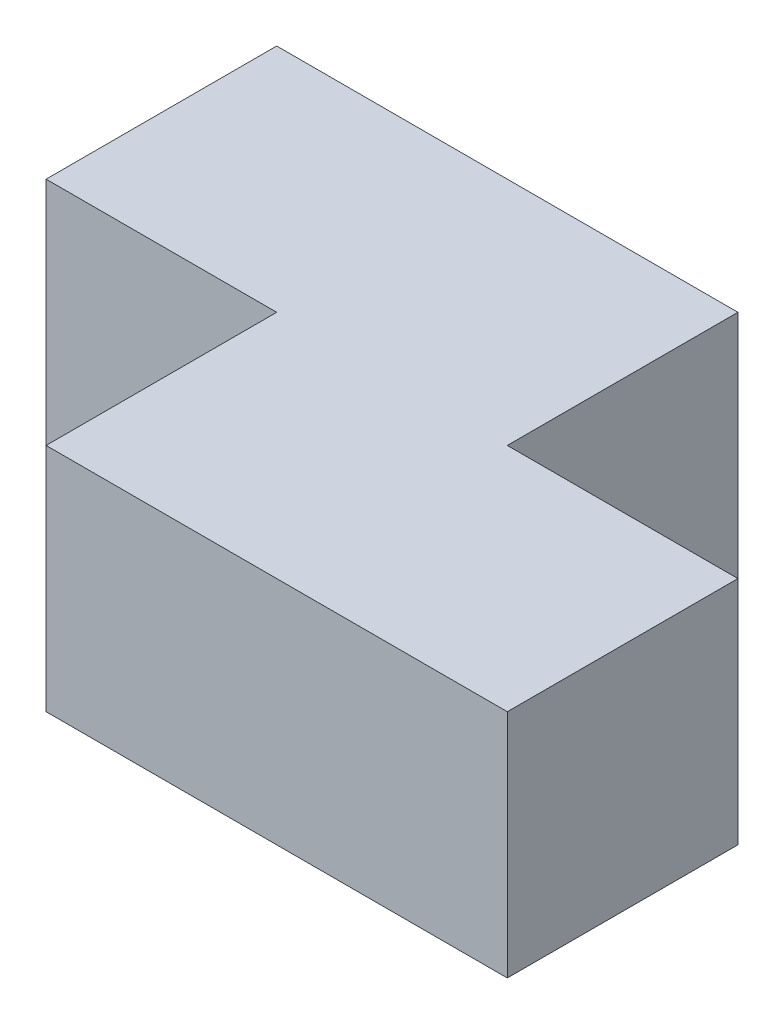
ISO-10303-21;
HEADER;
FILE_DESCRIPTION(('STEP AP214'),'2;1');
FILE_NAME('part.step','',(''),(''),'','','');
FILE_SCHEMA(('AUTOMOTIVE_DESIGN { 1 0 10303 214 1 1 1 1 }'));
ENDSEC;
DATA;
#1=APPLICATION_CONTEXT('core data for automotive mechanical design processes');
#2=APPLICATION_PROTOCOL_DEFINITION('international standard','automotive_design',2000,#1);
#3=PRODUCT_CONTEXT('',#1,'mechanical');
#4=PRODUCT('Part','Part','',(#3));
#5=PRODUCT_RELATED_PRODUCT_CATEGORY('part','',(#4));
#6=PRODUCT_DEFINITION_FORMATION('','',#4);
#7=PRODUCT_DEFINITION_CONTEXT('part definition',#1,'design');
#8=PRODUCT_DEFINITION('design','',#6,#7);
#9=PRODUCT_DEFINITION_SHAPE('','',#8);
#10=(LENGTH_UNIT() NAMED_UNIT(*) SI_UNIT(.MILLI.,.METRE.));
#11=(NAMED_UNIT(*) PLANE_ANGLE_UNIT() SI_UNIT($,.RADIAN.));
#12=(NAMED_UNIT(*) SI_UNIT($,.STERADIAN.) SOLID_ANGLE_UNIT());
#13=UNCERTAINTY_MEASURE_WITH_UNIT(LENGTH_MEASURE(1.E-05),#10,'distance_accuracy_value','');
#14=(GEOMETRIC_REPRESENTATION_CONTEXT(3) GLOBAL_UNCERTAINTY_ASSIGNED_CONTEXT((#13)) GLOBAL_UNIT_ASSIGNED_CONTEXT((#10,
#11,#12)) REPRESENTATION_CONTEXT('',''));
#15=CARTESIAN_POINT('',(0.,0.,0.));
#16=DIRECTION('',(0.,0.,1.));
#17=DIRECTION('',(1.,0.,0.));
#18=AXIS2_PLACEMENT_3D('',#15,#16,#17);
#19=CARTESIAN_POINT('',(0.,30.,0.));
#20=DIRECTION('',(0.,0.,-1.));
#21=DIRECTION('',(-1.,0.,0.));
#22=AXIS2_PLACEMENT_3D('',#19,#20,#21);
#23=PLANE('',#22);
#24=DIRECTION('',(1.,0.,0.));
#25=VECTOR('',#24,1.);
#26=CARTESIAN_POINT('',(0.,0.,0.));
#27=LINE('',#26,#25);
#28=CARTESIAN_POINT('',(0.,0.,0.));
#29=VERTEX_POINT('',#28);
#30=CARTESIAN_POINT('',(60.,0.,0.));
#31=VERTEX_POINT('',#30);
#32=EDGE_CURVE('E123',#29,#31,#27,.T.);
#33=ORIENTED_EDGE('',*,*,#32,.T.);
#34=DIRECTION('',(0.,-1.,0.));
#35=VECTOR('',#34,1.);
#36=CARTESIAN_POINT('',(60.,30.,0.));
#37=LINE('',#36,#35);
#38=CARTESIAN_POINT('',(60.,30.,0.));
#39=VERTEX_POINT('',#38);
#40=EDGE_CURVE('E11',#39,#31,#37,.T.);
#41=ORIENTED_EDGE('',*,*,#40,.F.);
#42=DIRECTION('',(1.,0.,0.));
#43=VECTOR('',#42,1.);
#44=CARTESIAN_POINT('',(0.,30.,0.));
#45=LINE('',#44,#43);
#46=CARTESIAN_POINT('',(0.,30.,0.));
#47=VERTEX_POINT('',#46);
#48=EDGE_CURVE('E116',#47,#39,#45,.T.);
#49=ORIENTED_EDGE('',*,*,#48,.F.);
#50=DIRECTION('',(0.,-1.,0.));
#51=VECTOR('',#50,1.);
#52=CARTESIAN_POINT('',(0.,30.,0.));
#53=LINE('',#52,#51);
#54=EDGE_CURVE('E55',#47,#29,#53,.T.);
#55=ORIENTED_EDGE('',*,*,#54,.T.);
#56=EDGE_LOOP('',(#33,#41,#49,#55));
#57=FACE_BOUND('',#56,.T.);
#58=ADVANCED_FACE('F39',(#57),#23,.F.);
#59=CARTESIAN_POINT('',(60.,30.,0.));
#60=DIRECTION('',(-1.,0.,0.));
#61=DIRECTION('',(0.,0.,1.));
#62=AXIS2_PLACEMENT_3D('',#59,#60,#61);
#63=PLANE('',#62);
#64=DIRECTION('',(0.,0.,-1.));
#65=VECTOR('',#64,1.);
#66=CARTESIAN_POINT('',(60.,0.,0.));
#67=LINE('',#66,#65);
#68=CARTESIAN_POINT('',(60.,0.,-30.));
#69=VERTEX_POINT('',#68);
#70=EDGE_CURVE('E125',#31,#69,#67,.T.);
#71=ORIENTED_EDGE('',*,*,#70,.T.);
#72=DIRECTION('',(0.,-1.,0.));
#73=VECTOR('',#72,1.);
#74=CARTESIAN_POINT('',(60.,30.,-30.));
#75=LINE('',#74,#73);
#76=CARTESIAN_POINT('',(60.,30.,-30.));
#77=VERTEX_POINT('',#76);
#78=EDGE_CURVE('E47',#77,#69,#75,.T.);
#79=ORIENTED_EDGE('',*,*,#78,.F.);
#80=DIRECTION('',(0.,0.,-1.));
#81=VECTOR('',#80,1.);
#82=CARTESIAN_POINT('',(60.,30.,0.));
#83=LINE('',#82,#81);
#84=EDGE_CURVE('E89',#39,#77,#83,.T.);
#85=ORIENTED_EDGE('',*,*,#84,.F.);
#86=ORIENTED_EDGE('',*,*,#40,.T.);
#87=EDGE_LOOP('',(#71,#79,#85,#86));
#88=FACE_BOUND('',#87,.T.);
#89=ADVANCED_FACE('F139',(#88),#63,.F.);
#90=CARTESIAN_POINT('',(0.,30.,-30.));
#91=DIRECTION('',(0.,0.,-1.));
#92=DIRECTION('',(-1.,0.,0.));
#93=AXIS2_PLACEMENT_3D('',#90,#91,#92);
#94=PLANE('',#93);
#95=DIRECTION('',(1.,0.,0.));
#96=VECTOR('',#95,1.);
#97=CARTESIAN_POINT('',(0.,0.,-30.));
#98=LINE('',#97,#96);
#99=CARTESIAN_POINT('',(30.,0.,-30.));
#100=VERTEX_POINT('',#99);
#101=EDGE_CURVE('E104',#100,#69,#98,.T.);
#102=ORIENTED_EDGE('',*,*,#101,.F.);
#103=DIRECTION('',(0.,-1.,0.));
#104=VECTOR('',#103,1.);
#105=CARTESIAN_POINT('',(30.,30.,-30.));
#106=LINE('',#105,#104);
#107=CARTESIAN_POINT('',(30.,30.,-30.));
#108=VERTEX_POINT('',#107);
#109=EDGE_CURVE('E98',#108,#100,#106,.T.);
#110=ORIENTED_EDGE('',*,*,#109,.F.);
#111=DIRECTION('',(1.,0.,0.));
#112=VECTOR('',#111,1.);
#113=CARTESIAN_POINT('',(0.,30.,-30.));
#114=LINE('',#113,#112);
#115=EDGE_CURVE('E102',#108,#77,#114,.T.);
#116=ORIENTED_EDGE('',*,*,#115,.T.);
#117=ORIENTED_EDGE('',*,*,#78,.T.);
#118=EDGE_LOOP('',(#102,#110,#116,#117));
#119=FACE_BOUND('',#118,.T.);
#120=ADVANCED_FACE('F100',(#119),#94,.T.);
#121=CARTESIAN_POINT('',(30.,30.,0.));
#122=DIRECTION('',(-1.,0.,0.));
#123=DIRECTION('',(0.,0.,1.));
#124=AXIS2_PLACEMENT_3D('',#121,#122,#123);
#125=PLANE('',#124);
#126=DIRECTION('',(0.,0.,-1.));
#127=VECTOR('',#126,1.);
#128=CARTESIAN_POINT('',(30.,0.,0.));
#129=LINE('',#128,#127);
#130=CARTESIAN_POINT('',(30.,0.,-60.));
#131=VERTEX_POINT('',#130);
#132=EDGE_CURVE('E130',#100,#131,#129,.T.);
#133=ORIENTED_EDGE('',*,*,#132,.T.);
#134=DIRECTION('',(0.,-1.,0.));
#135=VECTOR('',#134,1.);
#136=CARTESIAN_POINT('',(30.,30.,-60.));
#137=LINE('',#136,#135);
#138=CARTESIAN_POINT('',(30.,30.,-60.));
#139=VERTEX_POINT('',#138);
#140=EDGE_CURVE('E77',#139,#131,#137,.T.);
#141=ORIENTED_EDGE('',*,*,#140,.F.);
#142=DIRECTION('',(0.,0.,-1.));
#143=VECTOR('',#142,1.);
#144=CARTESIAN_POINT('',(30.,30.,0.));
#145=LINE('',#144,#143);
#146=EDGE_CURVE('E108',#108,#139,#145,.T.);
#147=ORIENTED_EDGE('',*,*,#146,.F.);
#148=ORIENTED_EDGE('',*,*,#109,.T.);
#149=EDGE_LOOP('',(#133,#141,#147,#148));
#150=FACE_BOUND('',#149,.T.);
#151=ADVANCED_FACE('F109',(#150),#125,.F.);
#152=CARTESIAN_POINT('',(0.,30.,-60.));
#153=DIRECTION('',(0.,0.,-1.));
#154=DIRECTION('',(-1.,0.,0.));
#155=AXIS2_PLACEMENT_3D('',#152,#153,#154);
#156=PLANE('',#155);
#157=DIRECTION('',(1.,0.,0.));
#158=VECTOR('',#157,1.);
#159=CARTESIAN_POINT('',(0.,0.,-60.));
#160=LINE('',#159,#158);
#161=CARTESIAN_POINT('',(-30.,0.,-60.));
#162=VERTEX_POINT('',#161);
#163=EDGE_CURVE('E132',#162,#131,#160,.T.);
#164=ORIENTED_EDGE('',*,*,#163,.F.);
#165=DIRECTION('',(0.,1.,0.));
#166=VECTOR('',#165,1.);
#167=CARTESIAN_POINT('',(-30.,0.,-60.));
#168=LINE('',#167,#166);
#169=CARTESIAN_POINT('',(-30.,30.,-60.));
#170=VERTEX_POINT('',#169);
#171=EDGE_CURVE('E152',#162,#170,#168,.T.);
#172=ORIENTED_EDGE('',*,*,#171,.T.);
#173=DIRECTION('',(1.,0.,0.));
#174=VECTOR('',#173,1.);
#175=CARTESIAN_POINT('',(0.,30.,-60.));
#176=LINE('',#175,#174);
#177=EDGE_CURVE('E112',#170,#139,#176,.T.);
#178=ORIENTED_EDGE('',*,*,#177,.T.);
#179=ORIENTED_EDGE('',*,*,#140,.T.);
#180=EDGE_LOOP('',(#164,#172,#178,#179));
#181=FACE_BOUND('',#180,.T.);
#182=ADVANCED_FACE('F150',(#181),#156,.T.);
#183=CARTESIAN_POINT('',(0.,30.,0.));
#184=DIRECTION('',(-1.,0.,0.));
#185=DIRECTION('',(0.,0.,1.));
#186=AXIS2_PLACEMENT_3D('',#183,#184,#185);
#187=PLANE('',#186);
#188=DIRECTION('',(0.,1.,0.));
#189=VECTOR('',#188,1.);
#190=CARTESIAN_POINT('',(0.,30.,-30.));
#191=LINE('',#190,#189);
#192=CARTESIAN_POINT('',(0.,0.,-30.));
#193=VERTEX_POINT('',#192);
#194=CARTESIAN_POINT('',(0.,30.,-30.));
#195=VERTEX_POINT('',#194);
#196=EDGE_CURVE('E126',#193,#195,#191,.T.);
#197=ORIENTED_EDGE('',*,*,#196,.F.);
#198=DIRECTION('',(0.,0.,-1.));
#199=VECTOR('',#198,1.);
#200=CARTESIAN_POINT('',(0.,0.,0.));
#201=LINE('',#200,#199);
#202=EDGE_CURVE('E135',#29,#193,#201,.T.);
#203=ORIENTED_EDGE('',*,*,#202,.F.);
#204=ORIENTED_EDGE('',*,*,#54,.F.);
#205=DIRECTION('',(0.,0.,-1.));
#206=VECTOR('',#205,1.);
#207=CARTESIAN_POINT('',(0.,30.,0.));
#208=LINE('',#207,#206);
#209=EDGE_CURVE('E121',#47,#195,#208,.T.);
#210=ORIENTED_EDGE('',*,*,#209,.T.);
#211=EDGE_LOOP('',(#197,#203,#204,#210));
#212=FACE_BOUND('',#211,.T.);
#213=ADVANCED_FACE('F177',(#212),#187,.T.);
#214=CARTESIAN_POINT('',(0.,30.,0.));
#215=DIRECTION('',(0.,1.,0.));
#216=DIRECTION('',(0.,0.,1.));
#217=AXIS2_PLACEMENT_3D('',#214,#215,#216);
#218=PLANE('',#217);
#219=ORIENTED_EDGE('',*,*,#115,.F.);
#220=ORIENTED_EDGE('',*,*,#146,.T.);
#221=ORIENTED_EDGE('',*,*,#177,.F.);
#222=DIRECTION('',(0.,0.,1.));
#223=VECTOR('',#222,1.);
#224=CARTESIAN_POINT('',(-30.,30.,-60.));
#225=LINE('',#224,#223);
#226=CARTESIAN_POINT('',(-30.,30.,-30.));
#227=VERTEX_POINT('',#226);
#228=EDGE_CURVE('E161',#170,#227,#225,.T.);
#229=ORIENTED_EDGE('',*,*,#228,.T.);
#230=DIRECTION('',(1.,0.,0.));
#231=VECTOR('',#230,1.);
#232=CARTESIAN_POINT('',(-30.,30.,-30.));
#233=LINE('',#232,#231);
#234=EDGE_CURVE('E169',#227,#195,#233,.T.);
#235=ORIENTED_EDGE('',*,*,#234,.T.);
#236=ORIENTED_EDGE('',*,*,#209,.F.);
#237=ORIENTED_EDGE('',*,*,#48,.T.);
#238=ORIENTED_EDGE('',*,*,#84,.T.);
#239=EDGE_LOOP('',(#219,#220,#221,#229,#235,#236,#237,#238));
#240=FACE_BOUND('',#239,.T.);
#241=ADVANCED_FACE('F114',(#240),#218,.T.);
#242=CARTESIAN_POINT('',(0.,0.,0.));
#243=DIRECTION('',(0.,1.,0.));
#244=DIRECTION('',(0.,0.,1.));
#245=AXIS2_PLACEMENT_3D('',#242,#243,#244);
#246=PLANE('',#245);
#247=ORIENTED_EDGE('',*,*,#202,.T.);
#248=DIRECTION('',(1.,0.,0.));
#249=VECTOR('',#248,1.);
#250=CARTESIAN_POINT('',(-30.,0.,-30.));
#251=LINE('',#250,#249);
#252=CARTESIAN_POINT('',(-30.,0.,-30.));
#253=VERTEX_POINT('',#252);
#254=EDGE_CURVE('E163',#253,#193,#251,.T.);
#255=ORIENTED_EDGE('',*,*,#254,.F.);
#256=DIRECTION('',(0.,0.,-1.));
#257=VECTOR('',#256,1.);
#258=CARTESIAN_POINT('',(-30.,0.,-30.));
#259=LINE('',#258,#257);
#260=EDGE_CURVE('E147',#253,#162,#259,.T.);
#261=ORIENTED_EDGE('',*,*,#260,.T.);
#262=ORIENTED_EDGE('',*,*,#163,.T.);
#263=ORIENTED_EDGE('',*,*,#132,.F.);
#264=ORIENTED_EDGE('',*,*,#101,.T.);
#265=ORIENTED_EDGE('',*,*,#70,.F.);
#266=ORIENTED_EDGE('',*,*,#32,.F.);
#267=EDGE_LOOP('',(#247,#255,#261,#262,#263,#264,#265,#266));
#268=FACE_BOUND('',#267,.T.);
#269=ADVANCED_FACE('F142',(#268),#246,.F.);
#270=CARTESIAN_POINT('',(-30.,30.,-30.));
#271=DIRECTION('',(0.,0.,1.));
#272=DIRECTION('',(1.,0.,0.));
#273=AXIS2_PLACEMENT_3D('',#270,#271,#272);
#274=PLANE('',#273);
#275=ORIENTED_EDGE('',*,*,#254,.T.);
#276=ORIENTED_EDGE('',*,*,#196,.T.);
#277=ORIENTED_EDGE('',*,*,#234,.F.);
#278=DIRECTION('',(0.,-1.,0.));
#279=VECTOR('',#278,1.);
#280=CARTESIAN_POINT('',(-30.,30.,-30.));
#281=LINE('',#280,#279);
#282=EDGE_CURVE('E165',#227,#253,#281,.T.);
#283=ORIENTED_EDGE('',*,*,#282,.T.);
#284=EDGE_LOOP('',(#275,#276,#277,#283));
#285=FACE_BOUND('',#284,.T.);
#286=ADVANCED_FACE('F181',(#285),#274,.T.);
#287=CARTESIAN_POINT('',(-30.,0.,0.));
#288=DIRECTION('',(1.,0.,0.));
#289=DIRECTION('',(0.,0.,-1.));
#290=AXIS2_PLACEMENT_3D('',#287,#288,#289);
#291=PLANE('',#290);
#292=ORIENTED_EDGE('',*,*,#282,.F.);
#293=ORIENTED_EDGE('',*,*,#228,.F.);
#294=ORIENTED_EDGE('',*,*,#171,.F.);
#295=ORIENTED_EDGE('',*,*,#260,.F.);
#296=EDGE_LOOP('',(#292,#293,#294,#295));
#297=FACE_BOUND('',#296,.T.);
#298=ADVANCED_FACE('F158',(#297),#291,.F.);
#299=CLOSED_SHELL('',(#58,#89,#120,#151,#182,#213,#241,#269,#286,#298));
#300=MANIFOLD_SOLID_BREP('B2',#299);
#301=ADVANCED_BREP_SHAPE_REPRESENTATION('',(#18,#300),#14);
#302=SHAPE_DEFINITION_REPRESENTATION(#9,#301);
ENDSEC;
END-ISO-10303-21;
